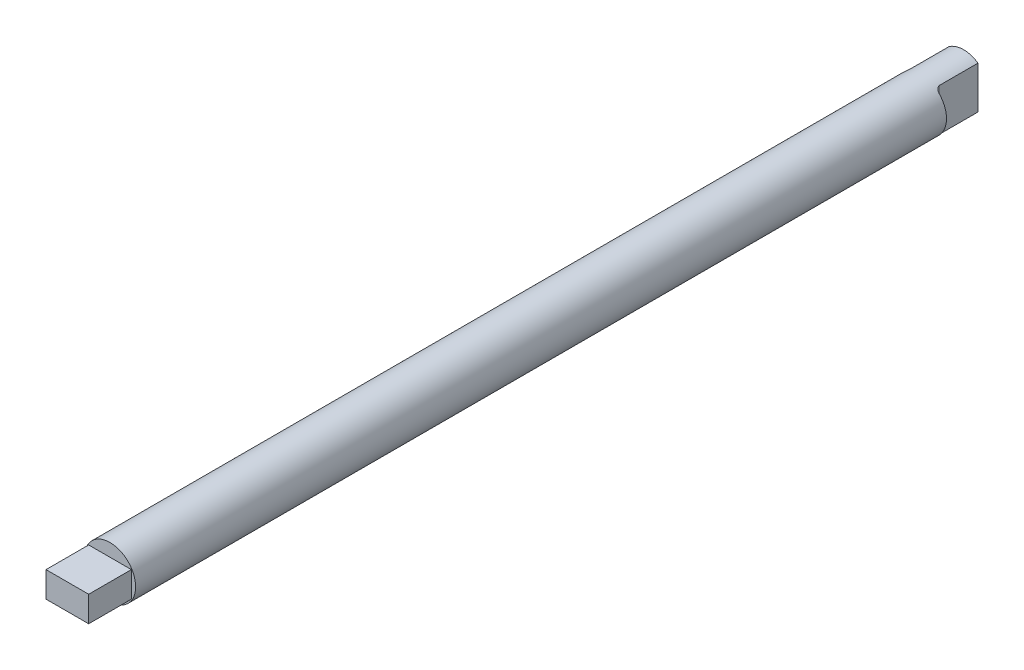
ISO-10303-21;
HEADER;
FILE_DESCRIPTION(('STEP AP214'),'2;1');
FILE_NAME('part.step','',(''),(''),'','','');
FILE_SCHEMA(('AUTOMOTIVE_DESIGN { 1 0 10303 214 1 1 1 1 }'));
ENDSEC;
DATA;
#1=APPLICATION_CONTEXT('core data for automotive mechanical design processes');
#2=APPLICATION_PROTOCOL_DEFINITION('international standard','automotive_design',2000,#1);
#3=PRODUCT_CONTEXT('',#1,'mechanical');
#4=PRODUCT('Part','Part','',(#3));
#5=PRODUCT_RELATED_PRODUCT_CATEGORY('part','',(#4));
#6=PRODUCT_DEFINITION_FORMATION('','',#4);
#7=PRODUCT_DEFINITION_CONTEXT('part definition',#1,'design');
#8=PRODUCT_DEFINITION('design','',#6,#7);
#9=PRODUCT_DEFINITION_SHAPE('','',#8);
#10=(LENGTH_UNIT() NAMED_UNIT(*) SI_UNIT(.MILLI.,.METRE.));
#11=(NAMED_UNIT(*) PLANE_ANGLE_UNIT() SI_UNIT($,.RADIAN.));
#12=(NAMED_UNIT(*) SI_UNIT($,.STERADIAN.) SOLID_ANGLE_UNIT());
#13=UNCERTAINTY_MEASURE_WITH_UNIT(LENGTH_MEASURE(1.E-05),#10,'distance_accuracy_value','');
#14=(GEOMETRIC_REPRESENTATION_CONTEXT(3) GLOBAL_UNCERTAINTY_ASSIGNED_CONTEXT((#13)) GLOBAL_UNIT_ASSIGNED_CONTEXT((#10,
#11,#12)) REPRESENTATION_CONTEXT('',''));
#15=CARTESIAN_POINT('',(0.,0.,0.));
#16=DIRECTION('',(0.,0.,1.));
#17=DIRECTION('',(1.,0.,0.));
#18=AXIS2_PLACEMENT_3D('',#15,#16,#17);
#19=CARTESIAN_POINT('',(0.,0.,200.));
#20=DIRECTION('',(0.,0.,-1.));
#21=DIRECTION('',(-1.,0.,0.));
#22=AXIS2_PLACEMENT_3D('',#19,#20,#21);
#23=CYLINDRICAL_SURFACE('',#22,6.);
#24=CARTESIAN_POINT('',(0.,0.,200.));
#25=DIRECTION('',(0.,0.,1.));
#26=DIRECTION('',(1.,0.,0.));
#27=AXIS2_PLACEMENT_3D('',#24,#25,#26);
#28=CIRCLE('',#27,6.);
#29=CARTESIAN_POINT('',(6.,0.,200.));
#30=VERTEX_POINT('',#29);
#31=EDGE_CURVE('E142',#30,#30,#28,.T.);
#32=ORIENTED_EDGE('',*,*,#31,.F.);
#33=EDGE_LOOP('',(#32));
#34=FACE_BOUND('',#33,.T.);
#35=DIRECTION('',(0.,0.,-1.));
#36=VECTOR('',#35,1.);
#37=CARTESIAN_POINT('',(-3.37456575062551,4.961079115949,200.));
#38=LINE('',#37,#36);
#39=CARTESIAN_POINT('',(-3.37456575062551,4.961079115949,0.));
#40=VERTEX_POINT('',#39);
#41=CARTESIAN_POINT('',(-3.37456575062551,4.961079115949,9.00000000000006));
#42=VERTEX_POINT('',#41);
#43=EDGE_CURVE('E130',#40,#42,#38,.F.);
#44=ORIENTED_EDGE('',*,*,#43,.T.);
#45=CARTESIAN_POINT('',(-3.37456575062551,4.961079115949,9.));
#46=CARTESIAN_POINT('',(-3.3745639924826,4.96107916515794,9.02434110568556));
#47=CARTESIAN_POINT('',(-3.37545522348942,4.960474203256,9.04866945914292));
#48=CARTESIAN_POINT('',(-3.37899774392141,4.95806223684848,9.09713022115942));
#49=CARTESIAN_POINT('',(-3.3816484846934,4.95625560704856,9.12126268842646));
#50=CARTESIAN_POINT('',(-3.39216513274182,4.94906977280551,9.19288277084369));
#51=CARTESIAN_POINT('',(-3.40259607886175,4.94192439559483,9.23985120224906));
#52=CARTESIAN_POINT('',(-3.42970853056334,4.92314599093406,9.33091552818408));
#53=CARTESIAN_POINT('',(-3.44638535927952,4.91151632109334,9.3750135431294));
#54=CARTESIAN_POINT('',(-3.48512756060251,4.88410150723419,9.45941002700145));
#55=CARTESIAN_POINT('',(-3.50719740553889,4.86831291344467,9.49970530374299));
#56=CARTESIAN_POINT('',(-3.55683993275268,4.83217047956457,9.57754222060474));
#57=CARTESIAN_POINT('',(-3.58462256735966,4.81163688585389,9.61486529152868));
#58=CARTESIAN_POINT('',(-3.64375799792012,4.76701199607574,9.68410221788423));
#59=CARTESIAN_POINT('',(-3.6751106355504,4.74292085776489,9.71601631303807));
#60=CARTESIAN_POINT('',(-3.75365919785286,4.68117873226478,9.78630302058265));
#61=CARTESIAN_POINT('',(-3.80208899965547,4.64201258852592,9.82197588641786));
#62=CARTESIAN_POINT('',(-3.90148456311963,4.55880012725732,9.88296069865836));
#63=CARTESIAN_POINT('',(-3.95246070739462,4.51473274659365,9.90822554510479));
#64=CARTESIAN_POINT('',(-4.066544272577,4.41251716066376,9.95378154954616));
#65=CARTESIAN_POINT('',(-4.12978534851647,4.3534398079925,9.97165168951954));
#66=CARTESIAN_POINT('',(-4.22310820206539,4.26230524282628,9.98896480701799));
#67=CARTESIAN_POINT('',(-4.25382015435601,4.23165547065735,9.99315600842451));
#68=CARTESIAN_POINT('',(-4.31465579179465,4.1696075280853,9.99866817715012));
#69=CARTESIAN_POINT('',(-4.34478025107691,4.13821048341469,9.99999321587235));
#70=CARTESIAN_POINT('',(-4.37456575062551,4.10647957421613,10.));
#71=B_SPLINE_CURVE_WITH_KNOTS('',3,(#45,#46,#47,#48,#49,#50,#51,#52,#53,#54,#55,#56,#57,#58,#59,
#60,#61,#62,#63,#64,#65,#66,#67,#68,#69,#70),.UNSPECIFIED.,.F.,.F.,(4,2,2,2,2,2,2,2,2,2,2,2,4),
(0.,0.0729746416838792,0.145926538979718,0.291066600158479,0.436098198235592,0.581250478974322,
0.733227934529697,0.8851986527824,1.0993459525876,1.31445197205829,1.57825767630163,
1.70895140016201,1.83945935046687),.UNSPECIFIED.);
#72=CARTESIAN_POINT('',(-4.37456575062551,4.10647957421613,10.));
#73=VERTEX_POINT('',#72);
#74=EDGE_CURVE('E11',#42,#73,#71,.T.);
#75=ORIENTED_EDGE('',*,*,#74,.T.);
#76=CARTESIAN_POINT('',(0.,0.,10.));
#77=DIRECTION('',(0.,0.,1.));
#78=DIRECTION('',(1.,0.,0.));
#79=AXIS2_PLACEMENT_3D('',#76,#77,#78);
#80=CIRCLE('',#79,6.);
#81=CARTESIAN_POINT('',(-4.37456575062551,-4.10647957421613,10.));
#82=VERTEX_POINT('',#81);
#83=EDGE_CURVE('E163',#73,#82,#80,.T.);
#84=ORIENTED_EDGE('',*,*,#83,.T.);
#85=CARTESIAN_POINT('',(-4.37456575062551,-4.10647957421613,10.));
#86=CARTESIAN_POINT('',(-4.34582278026622,-4.13709987982961,9.9999943435319));
#87=CARTESIAN_POINT('',(-4.31676366560814,-4.16740985283733,9.99875994046316));
#88=CARTESIAN_POINT('',(-4.25809756475281,-4.22733581866434,9.99363306392402));
#89=CARTESIAN_POINT('',(-4.22848994540253,-4.25695090681022,9.98973730485997));
#90=CARTESIAN_POINT('',(-4.13861090037188,-4.34498974881638,9.97367688041738));
#91=CARTESIAN_POINT('',(-4.07773946910032,-4.40212149707966,9.95713252552307));
#92=CARTESIAN_POINT('',(-3.96684877638237,-4.5020788959484,9.91469547871628));
#93=CARTESIAN_POINT('',(-3.91674391060801,-4.54568543393833,9.89087025790407));
#94=CARTESIAN_POINT('',(-3.81873836915409,-4.62831664058259,9.83322815778995));
#95=CARTESIAN_POINT('',(-3.7708306200933,-4.66735674816364,9.79944639049797));
#96=CARTESIAN_POINT('',(-3.68753316992823,-4.73332996795654,9.72830746590759));
#97=CARTESIAN_POINT('',(-3.65142974706362,-4.7611825165524,9.69264523938516));
#98=CARTESIAN_POINT('',(-3.58378494841692,-4.8123052654059,9.61428088823905));
#99=CARTESIAN_POINT('',(-3.55224473135471,-4.83557430232781,9.5715769814143));
#100=CARTESIAN_POINT('',(-3.49529649258927,-4.87690029869885,9.47941811530588));
#101=CARTESIAN_POINT('',(-3.46993820800979,-4.89491519911815,9.42991310777495));
#102=CARTESIAN_POINT('',(-3.42746003563778,-4.92475370773659,9.32578788037894));
#103=CARTESIAN_POINT('',(-3.41032616132977,-4.93658783007067,9.27117653478648));
#104=CARTESIAN_POINT('',(-3.39024873097183,-4.95038400834521,9.1800307402943));
#105=CARTESIAN_POINT('',(-3.38439224497681,-4.95438466862527,9.14441465373878));
#106=CARTESIAN_POINT('',(-3.37654174960307,-4.95973513608886,9.07254313722158));
#107=CARTESIAN_POINT('',(-3.3745500357009,-4.96108336787239,9.03628734019557));
#108=CARTESIAN_POINT('',(-3.37456575062551,-4.961079115949,9.));
#109=B_SPLINE_CURVE_WITH_KNOTS('',3,(#85,#86,#87,#88,#89,#90,#91,#92,#93,#94,#95,#96,#97,#98,
#99,#100,#101,#102,#103,#104,#105,#106,#107,#108),.UNSPECIFIED.,.F.,.F.,(4,2,2,2,2,2,2,2,2,2,2,
4),(0.,0.125944617137906,0.252045001649034,0.506228223908984,0.717198228212458,
0.927432966380897,1.10040559655118,1.27342207229384,1.44778773943328,1.6218558186582,
1.73051564771277,1.83923999540607),.UNSPECIFIED.);
#110=CARTESIAN_POINT('',(-3.37456575062551,-4.961079115949,9.00000000000006));
#111=VERTEX_POINT('',#110);
#112=EDGE_CURVE('E55',#82,#111,#109,.T.);
#113=ORIENTED_EDGE('',*,*,#112,.T.);
#114=DIRECTION('',(0.,0.,-1.));
#115=VECTOR('',#114,1.);
#116=CARTESIAN_POINT('',(-3.37456575062551,-4.961079115949,200.));
#117=LINE('',#116,#115);
#118=CARTESIAN_POINT('',(-3.37456575062551,-4.961079115949,0.));
#119=VERTEX_POINT('',#118);
#120=EDGE_CURVE('E266',#111,#119,#117,.T.);
#121=ORIENTED_EDGE('',*,*,#120,.T.);
#122=CARTESIAN_POINT('',(0.,0.,0.));
#123=DIRECTION('',(0.,0.,1.));
#124=DIRECTION('',(1.,0.,0.));
#125=AXIS2_PLACEMENT_3D('',#122,#123,#124);
#126=CIRCLE('',#125,6.);
#127=CARTESIAN_POINT('',(3.37456575062551,-4.961079115949,0.));
#128=VERTEX_POINT('',#127);
#129=EDGE_CURVE('E148',#119,#128,#126,.T.);
#130=ORIENTED_EDGE('',*,*,#129,.T.);
#131=DIRECTION('',(0.,0.,-1.));
#132=VECTOR('',#131,1.);
#133=CARTESIAN_POINT('',(3.37456575062551,-4.961079115949,200.));
#134=LINE('',#133,#132);
#135=CARTESIAN_POINT('',(3.37456575062551,-4.961079115949,9.00000000000006));
#136=VERTEX_POINT('',#135);
#137=EDGE_CURVE('E131',#128,#136,#134,.F.);
#138=ORIENTED_EDGE('',*,*,#137,.T.);
#139=CARTESIAN_POINT('',(3.37456575062551,-4.961079115949,9.));
#140=CARTESIAN_POINT('',(3.3745639924826,-4.96107916515794,9.02434110568556));
#141=CARTESIAN_POINT('',(3.37545522348942,-4.960474203256,9.04866945914292));
#142=CARTESIAN_POINT('',(3.37899774392141,-4.95806223684848,9.09713022115942));
#143=CARTESIAN_POINT('',(3.3816484846934,-4.95625560704856,9.12126268842646));
#144=CARTESIAN_POINT('',(3.39216513274182,-4.94906977280551,9.19288277084369));
#145=CARTESIAN_POINT('',(3.40259607886175,-4.94192439559483,9.23985120224906));
#146=CARTESIAN_POINT('',(3.42970853056334,-4.92314599093406,9.33091552818408));
#147=CARTESIAN_POINT('',(3.44638535927952,-4.91151632109334,9.3750135431294));
#148=CARTESIAN_POINT('',(3.48512756060251,-4.88410150723419,9.45941002700145));
#149=CARTESIAN_POINT('',(3.50719740553889,-4.86831291344467,9.49970530374299));
#150=CARTESIAN_POINT('',(3.55683993275268,-4.83217047956457,9.57754222060474));
#151=CARTESIAN_POINT('',(3.58462256735966,-4.81163688585389,9.61486529152868));
#152=CARTESIAN_POINT('',(3.64375799792012,-4.76701199607574,9.68410221788423));
#153=CARTESIAN_POINT('',(3.6751106355504,-4.74292085776489,9.71601631303807));
#154=CARTESIAN_POINT('',(3.75365919785286,-4.68117873226478,9.78630302058265));
#155=CARTESIAN_POINT('',(3.80208899965547,-4.64201258852592,9.82197588641786));
#156=CARTESIAN_POINT('',(3.90148456311963,-4.55880012725732,9.88296069865836));
#157=CARTESIAN_POINT('',(3.95246070739462,-4.51473274659365,9.90822554510479));
#158=CARTESIAN_POINT('',(4.066544272577,-4.41251716066376,9.95378154954616));
#159=CARTESIAN_POINT('',(4.12978534851647,-4.3534398079925,9.97165168951954));
#160=CARTESIAN_POINT('',(4.22310820206539,-4.26230524282628,9.98896480701799));
#161=CARTESIAN_POINT('',(4.25382015435601,-4.23165547065735,9.99315600842451));
#162=CARTESIAN_POINT('',(4.31465579179465,-4.1696075280853,9.99866817715012));
#163=CARTESIAN_POINT('',(4.34478025107691,-4.13821048341469,9.99999321587235));
#164=CARTESIAN_POINT('',(4.37456575062551,-4.10647957421613,10.));
#165=B_SPLINE_CURVE_WITH_KNOTS('',3,(#139,#140,#141,#142,#143,#144,#145,#146,#147,#148,#149,
#150,#151,#152,#153,#154,#155,#156,#157,#158,#159,#160,#161,#162,#163,#164),.UNSPECIFIED.,.F.,
.F.,(4,2,2,2,2,2,2,2,2,2,2,2,4),(0.,0.0729746416838792,0.145926538979718,0.291066600158479,
0.436098198235592,0.581250478974322,0.733227934529697,0.8851986527824,1.0993459525876,
1.31445197205829,1.57825767630163,1.70895140016201,1.83945935046687),.UNSPECIFIED.);
#166=CARTESIAN_POINT('',(4.37456575062551,-4.10647957421613,10.));
#167=VERTEX_POINT('',#166);
#168=EDGE_CURVE('E179',#136,#167,#165,.T.);
#169=ORIENTED_EDGE('',*,*,#168,.T.);
#170=CARTESIAN_POINT('',(0.,0.,10.));
#171=DIRECTION('',(0.,0.,-1.));
#172=DIRECTION('',(-1.,0.,0.));
#173=AXIS2_PLACEMENT_3D('',#170,#171,#172);
#174=CIRCLE('',#173,6.);
#175=CARTESIAN_POINT('',(4.37456575062551,4.10647957421613,10.));
#176=VERTEX_POINT('',#175);
#177=EDGE_CURVE('E159',#176,#167,#174,.T.);
#178=ORIENTED_EDGE('',*,*,#177,.F.);
#179=CARTESIAN_POINT('',(4.37456575062551,4.10647957421613,10.));
#180=CARTESIAN_POINT('',(4.34582278026622,4.13709987982961,9.9999943435319));
#181=CARTESIAN_POINT('',(4.31676366560814,4.16740985283733,9.99875994046316));
#182=CARTESIAN_POINT('',(4.25809756475281,4.22733581866434,9.99363306392402));
#183=CARTESIAN_POINT('',(4.22848994540253,4.25695090681022,9.98973730485997));
#184=CARTESIAN_POINT('',(4.13861090037188,4.34498974881638,9.97367688041738));
#185=CARTESIAN_POINT('',(4.07773946910032,4.40212149707966,9.95713252552307));
#186=CARTESIAN_POINT('',(3.96684877638237,4.5020788959484,9.91469547871628));
#187=CARTESIAN_POINT('',(3.91674391060801,4.54568543393833,9.89087025790407));
#188=CARTESIAN_POINT('',(3.81873836915409,4.62831664058259,9.83322815778995));
#189=CARTESIAN_POINT('',(3.7708306200933,4.66735674816364,9.79944639049797));
#190=CARTESIAN_POINT('',(3.68753316992823,4.73332996795654,9.72830746590759));
#191=CARTESIAN_POINT('',(3.65142974706362,4.7611825165524,9.69264523938516));
#192=CARTESIAN_POINT('',(3.58378494841692,4.8123052654059,9.61428088823905));
#193=CARTESIAN_POINT('',(3.55224473135471,4.83557430232781,9.5715769814143));
#194=CARTESIAN_POINT('',(3.49529649258927,4.87690029869885,9.47941811530588));
#195=CARTESIAN_POINT('',(3.46993820800979,4.89491519911815,9.42991310777495));
#196=CARTESIAN_POINT('',(3.42746003563778,4.92475370773659,9.32578788037894));
#197=CARTESIAN_POINT('',(3.41032616132977,4.93658783007067,9.27117653478648));
#198=CARTESIAN_POINT('',(3.39024873097183,4.95038400834521,9.1800307402943));
#199=CARTESIAN_POINT('',(3.38439224497681,4.95438466862527,9.14441465373878));
#200=CARTESIAN_POINT('',(3.37654174960307,4.95973513608886,9.07254313722158));
#201=CARTESIAN_POINT('',(3.3745500357009,4.96108336787239,9.03628734019557));
#202=CARTESIAN_POINT('',(3.37456575062551,4.961079115949,9.));
#203=B_SPLINE_CURVE_WITH_KNOTS('',3,(#179,#180,#181,#182,#183,#184,#185,#186,#187,#188,#189,
#190,#191,#192,#193,#194,#195,#196,#197,#198,#199,#200,#201,#202),.UNSPECIFIED.,.F.,.F.,(4,2,2,
2,2,2,2,2,2,2,2,4),(0.,0.125944617137906,0.252045001649034,0.506228223908984,0.717198228212458,
0.927432966380897,1.10040559655118,1.27342207229384,1.44778773943328,1.6218558186582,
1.73051564771277,1.83923999540607),.UNSPECIFIED.);
#204=CARTESIAN_POINT('',(3.37456575062551,4.961079115949,9.00000000000006));
#205=VERTEX_POINT('',#204);
#206=EDGE_CURVE('E126',#176,#205,#203,.T.);
#207=ORIENTED_EDGE('',*,*,#206,.T.);
#208=DIRECTION('',(0.,0.,-1.));
#209=VECTOR('',#208,1.);
#210=CARTESIAN_POINT('',(3.37456575062551,4.961079115949,200.));
#211=LINE('',#210,#209);
#212=CARTESIAN_POINT('',(3.37456575062551,4.961079115949,0.));
#213=VERTEX_POINT('',#212);
#214=EDGE_CURVE('E121',#205,#213,#211,.T.);
#215=ORIENTED_EDGE('',*,*,#214,.T.);
#216=EDGE_CURVE('E124',#213,#40,#126,.T.);
#217=ORIENTED_EDGE('',*,*,#216,.T.);
#218=EDGE_LOOP('',(#44,#75,#84,#113,#121,#130,#138,#169,#178,#207,#215,#217));
#219=FACE_BOUND('',#218,.T.);
#220=ADVANCED_FACE('F40',(#34,#219),#23,.T.);
#221=CARTESIAN_POINT('',(0.,0.,200.));
#222=DIRECTION('',(0.,0.,1.));
#223=DIRECTION('',(1.,0.,0.));
#224=AXIS2_PLACEMENT_3D('',#221,#222,#223);
#225=PLANE('',#224);
#226=DIRECTION('',(0.,1.,0.));
#227=VECTOR('',#226,1.);
#228=CARTESIAN_POINT('',(5.,3.,200.));
#229=LINE('',#228,#227);
#230=CARTESIAN_POINT('',(5.,-3.,200.));
#231=VERTEX_POINT('',#230);
#232=CARTESIAN_POINT('',(5.,3.,200.));
#233=VERTEX_POINT('',#232);
#234=EDGE_CURVE('E269',#231,#233,#229,.T.);
#235=ORIENTED_EDGE('',*,*,#234,.F.);
#236=DIRECTION('',(1.,0.,0.));
#237=VECTOR('',#236,1.);
#238=CARTESIAN_POINT('',(-5.,-3.,200.));
#239=LINE('',#238,#237);
#240=CARTESIAN_POINT('',(-5.,-3.,200.));
#241=VERTEX_POINT('',#240);
#242=EDGE_CURVE('E275',#241,#231,#239,.T.);
#243=ORIENTED_EDGE('',*,*,#242,.F.);
#244=DIRECTION('',(0.,-1.,0.));
#245=VECTOR('',#244,1.);
#246=CARTESIAN_POINT('',(-5.,3.,200.));
#247=LINE('',#246,#245);
#248=CARTESIAN_POINT('',(-5.,3.,200.));
#249=VERTEX_POINT('',#248);
#250=EDGE_CURVE('E292',#249,#241,#247,.T.);
#251=ORIENTED_EDGE('',*,*,#250,.F.);
#252=DIRECTION('',(-1.,0.,0.));
#253=VECTOR('',#252,1.);
#254=CARTESIAN_POINT('',(-5.,3.,200.));
#255=LINE('',#254,#253);
#256=EDGE_CURVE('E288',#233,#249,#255,.T.);
#257=ORIENTED_EDGE('',*,*,#256,.F.);
#258=EDGE_LOOP('',(#235,#243,#251,#257));
#259=FACE_BOUND('',#258,.T.);
#260=ORIENTED_EDGE('',*,*,#31,.T.);
#261=EDGE_LOOP('',(#260));
#262=FACE_BOUND('',#261,.T.);
#263=ADVANCED_FACE('F202',(#259,#262),#225,.T.);
#264=CARTESIAN_POINT('',(0.,0.,0.));
#265=DIRECTION('',(0.,0.,1.));
#266=DIRECTION('',(1.,0.,0.));
#267=AXIS2_PLACEMENT_3D('',#264,#265,#266);
#268=PLANE('',#267);
#269=ORIENTED_EDGE('',*,*,#129,.F.);
#270=DIRECTION('',(0.,1.,0.));
#271=VECTOR('',#270,1.);
#272=CARTESIAN_POINT('',(-3.37456575062551,0.,0.));
#273=LINE('',#272,#271);
#274=EDGE_CURVE('E141',#119,#40,#273,.T.);
#275=ORIENTED_EDGE('',*,*,#274,.T.);
#276=ORIENTED_EDGE('',*,*,#216,.F.);
#277=DIRECTION('',(0.,-1.,0.));
#278=VECTOR('',#277,1.);
#279=CARTESIAN_POINT('',(3.37456575062551,0.,0.));
#280=LINE('',#279,#278);
#281=EDGE_CURVE('E134',#213,#128,#280,.T.);
#282=ORIENTED_EDGE('',*,*,#281,.T.);
#283=EDGE_LOOP('',(#269,#275,#276,#282));
#284=FACE_BOUND('',#283,.T.);
#285=ADVANCED_FACE('F145',(#284),#268,.F.);
#286=CARTESIAN_POINT('',(5.,3.,210.));
#287=DIRECTION('',(-1.,0.,0.));
#288=DIRECTION('',(0.,0.,1.));
#289=AXIS2_PLACEMENT_3D('',#286,#287,#288);
#290=PLANE('',#289);
#291=ORIENTED_EDGE('',*,*,#234,.T.);
#292=DIRECTION('',(0.,0.,-1.));
#293=VECTOR('',#292,1.);
#294=CARTESIAN_POINT('',(5.,3.,210.));
#295=LINE('',#294,#293);
#296=CARTESIAN_POINT('',(5.,3.,210.));
#297=VERTEX_POINT('',#296);
#298=EDGE_CURVE('E154',#297,#233,#295,.T.);
#299=ORIENTED_EDGE('',*,*,#298,.F.);
#300=DIRECTION('',(0.,1.,0.));
#301=VECTOR('',#300,1.);
#302=CARTESIAN_POINT('',(5.,3.,210.));
#303=LINE('',#302,#301);
#304=CARTESIAN_POINT('',(5.,-3.,210.));
#305=VERTEX_POINT('',#304);
#306=EDGE_CURVE('E270',#305,#297,#303,.T.);
#307=ORIENTED_EDGE('',*,*,#306,.F.);
#308=DIRECTION('',(0.,0.,-1.));
#309=VECTOR('',#308,1.);
#310=CARTESIAN_POINT('',(5.,-3.,210.));
#311=LINE('',#310,#309);
#312=EDGE_CURVE('E284',#305,#231,#311,.T.);
#313=ORIENTED_EDGE('',*,*,#312,.T.);
#314=EDGE_LOOP('',(#291,#299,#307,#313));
#315=FACE_BOUND('',#314,.T.);
#316=ADVANCED_FACE('F216',(#315),#290,.F.);
#317=CARTESIAN_POINT('',(-5.,3.,210.));
#318=DIRECTION('',(0.,-1.,0.));
#319=DIRECTION('',(0.,0.,-1.));
#320=AXIS2_PLACEMENT_3D('',#317,#318,#319);
#321=PLANE('',#320);
#322=ORIENTED_EDGE('',*,*,#256,.T.);
#323=DIRECTION('',(0.,0.,-1.));
#324=VECTOR('',#323,1.);
#325=CARTESIAN_POINT('',(-5.,3.,210.));
#326=LINE('',#325,#324);
#327=CARTESIAN_POINT('',(-5.,3.,210.));
#328=VERTEX_POINT('',#327);
#329=EDGE_CURVE('E306',#328,#249,#326,.T.);
#330=ORIENTED_EDGE('',*,*,#329,.F.);
#331=DIRECTION('',(-1.,0.,0.));
#332=VECTOR('',#331,1.);
#333=CARTESIAN_POINT('',(-5.,3.,210.));
#334=LINE('',#333,#332);
#335=EDGE_CURVE('E274',#297,#328,#334,.T.);
#336=ORIENTED_EDGE('',*,*,#335,.F.);
#337=ORIENTED_EDGE('',*,*,#298,.T.);
#338=EDGE_LOOP('',(#322,#330,#336,#337));
#339=FACE_BOUND('',#338,.T.);
#340=ADVANCED_FACE('F220',(#339),#321,.F.);
#341=CARTESIAN_POINT('',(-5.,3.,210.));
#342=DIRECTION('',(1.,0.,0.));
#343=DIRECTION('',(0.,1.,0.));
#344=AXIS2_PLACEMENT_3D('',#341,#342,#343);
#345=PLANE('',#344);
#346=ORIENTED_EDGE('',*,*,#250,.T.);
#347=DIRECTION('',(0.,0.,-1.));
#348=VECTOR('',#347,1.);
#349=CARTESIAN_POINT('',(-5.,-3.,210.));
#350=LINE('',#349,#348);
#351=CARTESIAN_POINT('',(-5.,-3.,210.));
#352=VERTEX_POINT('',#351);
#353=EDGE_CURVE('E302',#352,#241,#350,.T.);
#354=ORIENTED_EDGE('',*,*,#353,.F.);
#355=DIRECTION('',(0.,-1.,0.));
#356=VECTOR('',#355,1.);
#357=CARTESIAN_POINT('',(-5.,3.,210.));
#358=LINE('',#357,#356);
#359=EDGE_CURVE('E278',#328,#352,#358,.T.);
#360=ORIENTED_EDGE('',*,*,#359,.F.);
#361=ORIENTED_EDGE('',*,*,#329,.T.);
#362=EDGE_LOOP('',(#346,#354,#360,#361));
#363=FACE_BOUND('',#362,.T.);
#364=ADVANCED_FACE('F224',(#363),#345,.F.);
#365=CARTESIAN_POINT('',(-5.,-3.,210.));
#366=DIRECTION('',(0.,1.,0.));
#367=DIRECTION('',(0.,0.,1.));
#368=AXIS2_PLACEMENT_3D('',#365,#366,#367);
#369=PLANE('',#368);
#370=ORIENTED_EDGE('',*,*,#242,.T.);
#371=ORIENTED_EDGE('',*,*,#312,.F.);
#372=DIRECTION('',(1.,0.,0.));
#373=VECTOR('',#372,1.);
#374=CARTESIAN_POINT('',(-5.,-3.,210.));
#375=LINE('',#374,#373);
#376=EDGE_CURVE('E281',#352,#305,#375,.T.);
#377=ORIENTED_EDGE('',*,*,#376,.F.);
#378=ORIENTED_EDGE('',*,*,#353,.T.);
#379=EDGE_LOOP('',(#370,#371,#377,#378));
#380=FACE_BOUND('',#379,.T.);
#381=ADVANCED_FACE('F228',(#380),#369,.F.);
#382=CARTESIAN_POINT('',(0.,0.,210.));
#383=DIRECTION('',(0.,0.,1.));
#384=DIRECTION('',(1.,0.,0.));
#385=AXIS2_PLACEMENT_3D('',#382,#383,#384);
#386=PLANE('',#385);
#387=ORIENTED_EDGE('',*,*,#306,.T.);
#388=ORIENTED_EDGE('',*,*,#335,.T.);
#389=ORIENTED_EDGE('',*,*,#359,.T.);
#390=ORIENTED_EDGE('',*,*,#376,.T.);
#391=EDGE_LOOP('',(#387,#388,#389,#390));
#392=FACE_BOUND('',#391,.T.);
#393=ADVANCED_FACE('F232',(#392),#386,.T.);
#394=CARTESIAN_POINT('',(0.,0.,10.));
#395=DIRECTION('',(0.,0.,-1.));
#396=DIRECTION('',(-1.,0.,0.));
#397=AXIS2_PLACEMENT_3D('',#394,#395,#396);
#398=PLANE('',#397);
#399=ORIENTED_EDGE('',*,*,#177,.T.);
#400=DIRECTION('',(0.,1.,0.));
#401=VECTOR('',#400,1.);
#402=CARTESIAN_POINT('',(4.37456575062551,0.,10.));
#403=LINE('',#402,#401);
#404=EDGE_CURVE('E166',#167,#176,#403,.T.);
#405=ORIENTED_EDGE('',*,*,#404,.T.);
#406=EDGE_LOOP('',(#399,#405));
#407=FACE_BOUND('',#406,.T.);
#408=ADVANCED_FACE('F236',(#407),#398,.T.);
#409=CARTESIAN_POINT('',(3.37456575062551,-6.,10.));
#410=DIRECTION('',(-1.,0.,0.));
#411=DIRECTION('',(0.,0.,1.));
#412=AXIS2_PLACEMENT_3D('',#409,#410,#411);
#413=PLANE('',#412);
#414=ORIENTED_EDGE('',*,*,#214,.F.);
#415=DIRECTION('',(0.,1.,0.));
#416=VECTOR('',#415,1.);
#417=CARTESIAN_POINT('',(3.37456575062551,-6.,9.));
#418=LINE('',#417,#416);
#419=EDGE_CURVE('E170',#205,#136,#418,.F.);
#420=ORIENTED_EDGE('',*,*,#419,.T.);
#421=ORIENTED_EDGE('',*,*,#137,.F.);
#422=ORIENTED_EDGE('',*,*,#281,.F.);
#423=EDGE_LOOP('',(#414,#420,#421,#422));
#424=FACE_BOUND('',#423,.T.);
#425=ADVANCED_FACE('F135',(#424),#413,.F.);
#426=CARTESIAN_POINT('',(0.,0.,10.));
#427=DIRECTION('',(0.,0.,1.));
#428=DIRECTION('',(1.,0.,0.));
#429=AXIS2_PLACEMENT_3D('',#426,#427,#428);
#430=PLANE('',#429);
#431=ORIENTED_EDGE('',*,*,#83,.F.);
#432=DIRECTION('',(0.,-1.,0.));
#433=VECTOR('',#432,1.);
#434=CARTESIAN_POINT('',(-4.37456575062551,-4.961079115949,10.));
#435=LINE('',#434,#433);
#436=EDGE_CURVE('E249',#73,#82,#435,.T.);
#437=ORIENTED_EDGE('',*,*,#436,.T.);
#438=EDGE_LOOP('',(#431,#437));
#439=FACE_BOUND('',#438,.T.);
#440=ADVANCED_FACE('F198',(#439),#430,.F.);
#441=CARTESIAN_POINT('',(-3.37456575062551,-6.,10.));
#442=DIRECTION('',(1.,0.,0.));
#443=DIRECTION('',(0.,0.,-1.));
#444=AXIS2_PLACEMENT_3D('',#441,#442,#443);
#445=PLANE('',#444);
#446=ORIENTED_EDGE('',*,*,#120,.F.);
#447=DIRECTION('',(0.,-1.,0.));
#448=VECTOR('',#447,1.);
#449=CARTESIAN_POINT('',(-3.37456575062551,4.961079115949,9.));
#450=LINE('',#449,#448);
#451=EDGE_CURVE('E68',#111,#42,#450,.F.);
#452=ORIENTED_EDGE('',*,*,#451,.T.);
#453=ORIENTED_EDGE('',*,*,#43,.F.);
#454=ORIENTED_EDGE('',*,*,#274,.F.);
#455=EDGE_LOOP('',(#446,#452,#453,#454));
#456=FACE_BOUND('',#455,.T.);
#457=ADVANCED_FACE('F190',(#456),#445,.F.);
#458=CARTESIAN_POINT('',(4.37456575062551,0.,9.));
#459=DIRECTION('',(0.,1.,0.));
#460=DIRECTION('',(0.,0.,1.));
#461=AXIS2_PLACEMENT_3D('',#458,#459,#460);
#462=CYLINDRICAL_SURFACE('',#461,1.);
#463=ORIENTED_EDGE('',*,*,#168,.F.);
#464=ORIENTED_EDGE('',*,*,#419,.F.);
#465=ORIENTED_EDGE('',*,*,#206,.F.);
#466=ORIENTED_EDGE('',*,*,#404,.F.);
#467=EDGE_LOOP('',(#463,#464,#465,#466));
#468=FACE_BOUND('',#467,.T.);
#469=ADVANCED_FACE('F187',(#468),#462,.F.);
#470=CARTESIAN_POINT('',(-4.37456575062551,0.,9.));
#471=DIRECTION('',(0.,1.,0.));
#472=DIRECTION('',(0.,0.,1.));
#473=AXIS2_PLACEMENT_3D('',#470,#471,#472);
#474=CYLINDRICAL_SURFACE('',#473,1.);
#475=ORIENTED_EDGE('',*,*,#74,.F.);
#476=ORIENTED_EDGE('',*,*,#451,.F.);
#477=ORIENTED_EDGE('',*,*,#112,.F.);
#478=ORIENTED_EDGE('',*,*,#436,.F.);
#479=EDGE_LOOP('',(#475,#476,#477,#478));
#480=FACE_BOUND('',#479,.T.);
#481=ADVANCED_FACE('F42',(#480),#474,.F.);
#482=CLOSED_SHELL('',(#220,#263,#285,#316,#340,#364,#381,#393,#408,#425,#440,#457,#469,#481));
#483=MANIFOLD_SOLID_BREP('B2',#482);
#484=ADVANCED_BREP_SHAPE_REPRESENTATION('',(#18,#483),#14);
#485=SHAPE_DEFINITION_REPRESENTATION(#9,#484);
ENDSEC;
END-ISO-10303-21;
